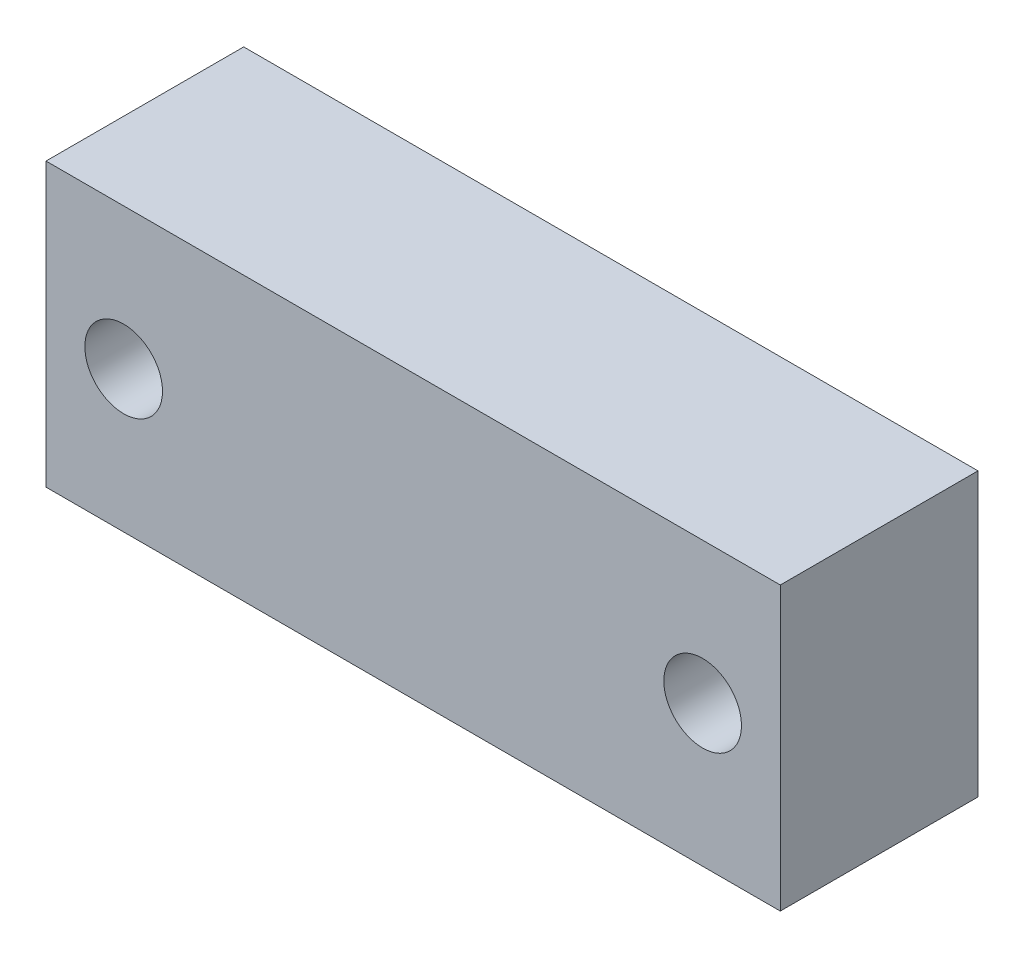
ISO-10303-21;
HEADER;
FILE_DESCRIPTION(('STEP AP214'),'2;1');
FILE_NAME('part.step','',(''),(''),'','','');
FILE_SCHEMA(('AUTOMOTIVE_DESIGN { 1 0 10303 214 1 1 1 1 }'));
ENDSEC;
DATA;
#1=APPLICATION_CONTEXT('core data for automotive mechanical design processes');
#2=APPLICATION_PROTOCOL_DEFINITION('international standard','automotive_design',2000,#1);
#3=PRODUCT_CONTEXT('',#1,'mechanical');
#4=PRODUCT('Part','Part','',(#3));
#5=PRODUCT_RELATED_PRODUCT_CATEGORY('part','',(#4));
#6=PRODUCT_DEFINITION_FORMATION('','',#4);
#7=PRODUCT_DEFINITION_CONTEXT('part definition',#1,'design');
#8=PRODUCT_DEFINITION('design','',#6,#7);
#9=PRODUCT_DEFINITION_SHAPE('','',#8);
#10=(LENGTH_UNIT() NAMED_UNIT(*) SI_UNIT(.MILLI.,.METRE.));
#11=(NAMED_UNIT(*) PLANE_ANGLE_UNIT() SI_UNIT($,.RADIAN.));
#12=(NAMED_UNIT(*) SI_UNIT($,.STERADIAN.) SOLID_ANGLE_UNIT());
#13=UNCERTAINTY_MEASURE_WITH_UNIT(LENGTH_MEASURE(1.E-05),#10,'distance_accuracy_value','');
#14=(GEOMETRIC_REPRESENTATION_CONTEXT(3) GLOBAL_UNCERTAINTY_ASSIGNED_CONTEXT((#13)) GLOBAL_UNIT_ASSIGNED_CONTEXT((#10,
#11,#12)) REPRESENTATION_CONTEXT('',''));
#15=CARTESIAN_POINT('',(0.,0.,0.));
#16=DIRECTION('',(0.,0.,1.));
#17=DIRECTION('',(1.,0.,0.));
#18=AXIS2_PLACEMENT_3D('',#15,#16,#17);
#19=CARTESIAN_POINT('',(26.,10.,14.));
#20=DIRECTION('',(-1.,0.,0.));
#21=DIRECTION('',(0.,0.,1.));
#22=AXIS2_PLACEMENT_3D('',#19,#20,#21);
#23=PLANE('',#22);
#24=DIRECTION('',(0.,1.,0.));
#25=VECTOR('',#24,1.);
#26=CARTESIAN_POINT('',(26.,10.,0.));
#27=LINE('',#26,#25);
#28=CARTESIAN_POINT('',(26.,-10.,0.));
#29=VERTEX_POINT('',#28);
#30=CARTESIAN_POINT('',(26.,10.,0.));
#31=VERTEX_POINT('',#30);
#32=EDGE_CURVE('E111',#29,#31,#27,.T.);
#33=ORIENTED_EDGE('',*,*,#32,.T.);
#34=DIRECTION('',(0.,0.,-1.));
#35=VECTOR('',#34,1.);
#36=CARTESIAN_POINT('',(26.,10.,14.));
#37=LINE('',#36,#35);
#38=CARTESIAN_POINT('',(26.,10.,14.));
#39=VERTEX_POINT('',#38);
#40=EDGE_CURVE('E11',#39,#31,#37,.T.);
#41=ORIENTED_EDGE('',*,*,#40,.F.);
#42=DIRECTION('',(0.,1.,0.));
#43=VECTOR('',#42,1.);
#44=CARTESIAN_POINT('',(26.,10.,14.));
#45=LINE('',#44,#43);
#46=CARTESIAN_POINT('',(26.,-10.,14.));
#47=VERTEX_POINT('',#46);
#48=EDGE_CURVE('E95',#47,#39,#45,.T.);
#49=ORIENTED_EDGE('',*,*,#48,.F.);
#50=DIRECTION('',(0.,0.,-1.));
#51=VECTOR('',#50,1.);
#52=CARTESIAN_POINT('',(26.,-10.,14.));
#53=LINE('',#52,#51);
#54=EDGE_CURVE('E107',#47,#29,#53,.T.);
#55=ORIENTED_EDGE('',*,*,#54,.T.);
#56=EDGE_LOOP('',(#33,#41,#49,#55));
#57=FACE_BOUND('',#56,.T.);
#58=ADVANCED_FACE('F43',(#57),#23,.F.);
#59=CARTESIAN_POINT('',(-26.,10.,14.));
#60=DIRECTION('',(0.,-1.,0.));
#61=DIRECTION('',(0.,0.,-1.));
#62=AXIS2_PLACEMENT_3D('',#59,#60,#61);
#63=PLANE('',#62);
#64=DIRECTION('',(-1.,0.,0.));
#65=VECTOR('',#64,1.);
#66=CARTESIAN_POINT('',(-26.,10.,0.));
#67=LINE('',#66,#65);
#68=CARTESIAN_POINT('',(-26.,10.,0.));
#69=VERTEX_POINT('',#68);
#70=EDGE_CURVE('E100',#31,#69,#67,.T.);
#71=ORIENTED_EDGE('',*,*,#70,.T.);
#72=DIRECTION('',(0.,0.,-1.));
#73=VECTOR('',#72,1.);
#74=CARTESIAN_POINT('',(-26.,10.,14.));
#75=LINE('',#74,#73);
#76=CARTESIAN_POINT('',(-26.,10.,14.));
#77=VERTEX_POINT('',#76);
#78=EDGE_CURVE('E52',#77,#69,#75,.T.);
#79=ORIENTED_EDGE('',*,*,#78,.F.);
#80=DIRECTION('',(-1.,0.,0.));
#81=VECTOR('',#80,1.);
#82=CARTESIAN_POINT('',(-26.,10.,14.));
#83=LINE('',#82,#81);
#84=EDGE_CURVE('E90',#39,#77,#83,.T.);
#85=ORIENTED_EDGE('',*,*,#84,.F.);
#86=ORIENTED_EDGE('',*,*,#40,.T.);
#87=EDGE_LOOP('',(#71,#79,#85,#86));
#88=FACE_BOUND('',#87,.T.);
#89=ADVANCED_FACE('F99',(#88),#63,.F.);
#90=CARTESIAN_POINT('',(-26.,10.,14.));
#91=DIRECTION('',(1.,0.,0.));
#92=DIRECTION('',(0.,1.,0.));
#93=AXIS2_PLACEMENT_3D('',#90,#91,#92);
#94=PLANE('',#93);
#95=DIRECTION('',(0.,-1.,0.));
#96=VECTOR('',#95,1.);
#97=CARTESIAN_POINT('',(-26.,10.,0.));
#98=LINE('',#97,#96);
#99=CARTESIAN_POINT('',(-26.,-10.,0.));
#100=VERTEX_POINT('',#99);
#101=EDGE_CURVE('E77',#69,#100,#98,.T.);
#102=ORIENTED_EDGE('',*,*,#101,.T.);
#103=DIRECTION('',(0.,0.,-1.));
#104=VECTOR('',#103,1.);
#105=CARTESIAN_POINT('',(-26.,-10.,14.));
#106=LINE('',#105,#104);
#107=CARTESIAN_POINT('',(-26.,-10.,14.));
#108=VERTEX_POINT('',#107);
#109=EDGE_CURVE('E102',#108,#100,#106,.T.);
#110=ORIENTED_EDGE('',*,*,#109,.F.);
#111=DIRECTION('',(0.,-1.,0.));
#112=VECTOR('',#111,1.);
#113=CARTESIAN_POINT('',(-26.,10.,14.));
#114=LINE('',#113,#112);
#115=EDGE_CURVE('E93',#77,#108,#114,.T.);
#116=ORIENTED_EDGE('',*,*,#115,.F.);
#117=ORIENTED_EDGE('',*,*,#78,.T.);
#118=EDGE_LOOP('',(#102,#110,#116,#117));
#119=FACE_BOUND('',#118,.T.);
#120=ADVANCED_FACE('F103',(#119),#94,.F.);
#121=CARTESIAN_POINT('',(-26.,-10.,14.));
#122=DIRECTION('',(0.,1.,0.));
#123=DIRECTION('',(0.,0.,1.));
#124=AXIS2_PLACEMENT_3D('',#121,#122,#123);
#125=PLANE('',#124);
#126=DIRECTION('',(1.,0.,0.));
#127=VECTOR('',#126,1.);
#128=CARTESIAN_POINT('',(-26.,-10.,0.));
#129=LINE('',#128,#127);
#130=EDGE_CURVE('E83',#100,#29,#129,.T.);
#131=ORIENTED_EDGE('',*,*,#130,.T.);
#132=ORIENTED_EDGE('',*,*,#54,.F.);
#133=DIRECTION('',(1.,0.,0.));
#134=VECTOR('',#133,1.);
#135=CARTESIAN_POINT('',(-26.,-10.,14.));
#136=LINE('',#135,#134);
#137=EDGE_CURVE('E60',#108,#47,#136,.T.);
#138=ORIENTED_EDGE('',*,*,#137,.F.);
#139=ORIENTED_EDGE('',*,*,#109,.T.);
#140=EDGE_LOOP('',(#131,#132,#138,#139));
#141=FACE_BOUND('',#140,.T.);
#142=ADVANCED_FACE('F125',(#141),#125,.F.);
#143=CARTESIAN_POINT('',(0.,0.,14.));
#144=DIRECTION('',(0.,0.,1.));
#145=DIRECTION('',(1.,0.,0.));
#146=AXIS2_PLACEMENT_3D('',#143,#144,#145);
#147=PLANE('',#146);
#148=CARTESIAN_POINT('',(-20.5,0.,14.));
#149=DIRECTION('',(0.,0.,1.));
#150=DIRECTION('',(1.,0.,0.));
#151=AXIS2_PLACEMENT_3D('',#148,#149,#150);
#152=CIRCLE('',#151,2.75);
#153=CARTESIAN_POINT('',(-17.75,0.,14.));
#154=VERTEX_POINT('',#153);
#155=EDGE_CURVE('E143',#154,#154,#152,.T.);
#156=ORIENTED_EDGE('',*,*,#155,.F.);
#157=EDGE_LOOP('',(#156));
#158=FACE_BOUND('',#157,.T.);
#159=CARTESIAN_POINT('',(20.5,0.,14.));
#160=DIRECTION('',(0.,0.,1.));
#161=DIRECTION('',(1.,0.,0.));
#162=AXIS2_PLACEMENT_3D('',#159,#160,#161);
#163=CIRCLE('',#162,2.75);
#164=CARTESIAN_POINT('',(23.25,0.,14.));
#165=VERTEX_POINT('',#164);
#166=EDGE_CURVE('E135',#165,#165,#163,.T.);
#167=ORIENTED_EDGE('',*,*,#166,.F.);
#168=EDGE_LOOP('',(#167));
#169=FACE_BOUND('',#168,.T.);
#170=ORIENTED_EDGE('',*,*,#48,.T.);
#171=ORIENTED_EDGE('',*,*,#84,.T.);
#172=ORIENTED_EDGE('',*,*,#115,.T.);
#173=ORIENTED_EDGE('',*,*,#137,.T.);
#174=EDGE_LOOP('',(#170,#171,#172,#173));
#175=FACE_BOUND('',#174,.T.);
#176=ADVANCED_FACE('F91',(#158,#169,#175),#147,.T.);
#177=CARTESIAN_POINT('',(0.,0.,0.));
#178=DIRECTION('',(0.,0.,1.));
#179=DIRECTION('',(1.,0.,0.));
#180=AXIS2_PLACEMENT_3D('',#177,#178,#179);
#181=PLANE('',#180);
#182=CARTESIAN_POINT('',(-20.5,0.,0.));
#183=DIRECTION('',(0.,0.,1.));
#184=DIRECTION('',(1.,0.,0.));
#185=AXIS2_PLACEMENT_3D('',#182,#183,#184);
#186=CIRCLE('',#185,2.75);
#187=CARTESIAN_POINT('',(-17.75,0.,0.));
#188=VERTEX_POINT('',#187);
#189=EDGE_CURVE('E139',#188,#188,#186,.T.);
#190=ORIENTED_EDGE('',*,*,#189,.T.);
#191=EDGE_LOOP('',(#190));
#192=FACE_BOUND('',#191,.T.);
#193=CARTESIAN_POINT('',(20.5,0.,0.));
#194=DIRECTION('',(0.,0.,1.));
#195=DIRECTION('',(1.,0.,0.));
#196=AXIS2_PLACEMENT_3D('',#193,#194,#195);
#197=CIRCLE('',#196,2.75);
#198=CARTESIAN_POINT('',(23.25,0.,0.));
#199=VERTEX_POINT('',#198);
#200=EDGE_CURVE('E115',#199,#199,#197,.T.);
#201=ORIENTED_EDGE('',*,*,#200,.T.);
#202=EDGE_LOOP('',(#201));
#203=FACE_BOUND('',#202,.T.);
#204=ORIENTED_EDGE('',*,*,#32,.F.);
#205=ORIENTED_EDGE('',*,*,#130,.F.);
#206=ORIENTED_EDGE('',*,*,#101,.F.);
#207=ORIENTED_EDGE('',*,*,#70,.F.);
#208=EDGE_LOOP('',(#204,#205,#206,#207));
#209=FACE_BOUND('',#208,.T.);
#210=ADVANCED_FACE('F128',(#192,#203,#209),#181,.F.);
#211=CARTESIAN_POINT('',(20.5,0.,14.));
#212=DIRECTION('',(0.,0.,1.));
#213=DIRECTION('',(1.,0.,0.));
#214=AXIS2_PLACEMENT_3D('',#211,#212,#213);
#215=CYLINDRICAL_SURFACE('',#214,2.75);
#216=ORIENTED_EDGE('',*,*,#200,.F.);
#217=EDGE_LOOP('',(#216));
#218=FACE_BOUND('',#217,.T.);
#219=ORIENTED_EDGE('',*,*,#166,.T.);
#220=EDGE_LOOP('',(#219));
#221=FACE_BOUND('',#220,.T.);
#222=ADVANCED_FACE('F155',(#218,#221),#215,.F.);
#223=CARTESIAN_POINT('',(-20.5,0.,14.));
#224=DIRECTION('',(0.,0.,1.));
#225=DIRECTION('',(1.,0.,0.));
#226=AXIS2_PLACEMENT_3D('',#223,#224,#225);
#227=CYLINDRICAL_SURFACE('',#226,2.75);
#228=ORIENTED_EDGE('',*,*,#189,.F.);
#229=EDGE_LOOP('',(#228));
#230=FACE_BOUND('',#229,.T.);
#231=ORIENTED_EDGE('',*,*,#155,.T.);
#232=EDGE_LOOP('',(#231));
#233=FACE_BOUND('',#232,.T.);
#234=ADVANCED_FACE('F148',(#230,#233),#227,.F.);
#235=CLOSED_SHELL('',(#58,#89,#120,#142,#176,#210,#222,#234));
#236=MANIFOLD_SOLID_BREP('B2',#235);
#237=ADVANCED_BREP_SHAPE_REPRESENTATION('',(#18,#236),#14);
#238=SHAPE_DEFINITION_REPRESENTATION(#9,#237);
ENDSEC;
END-ISO-10303-21;
